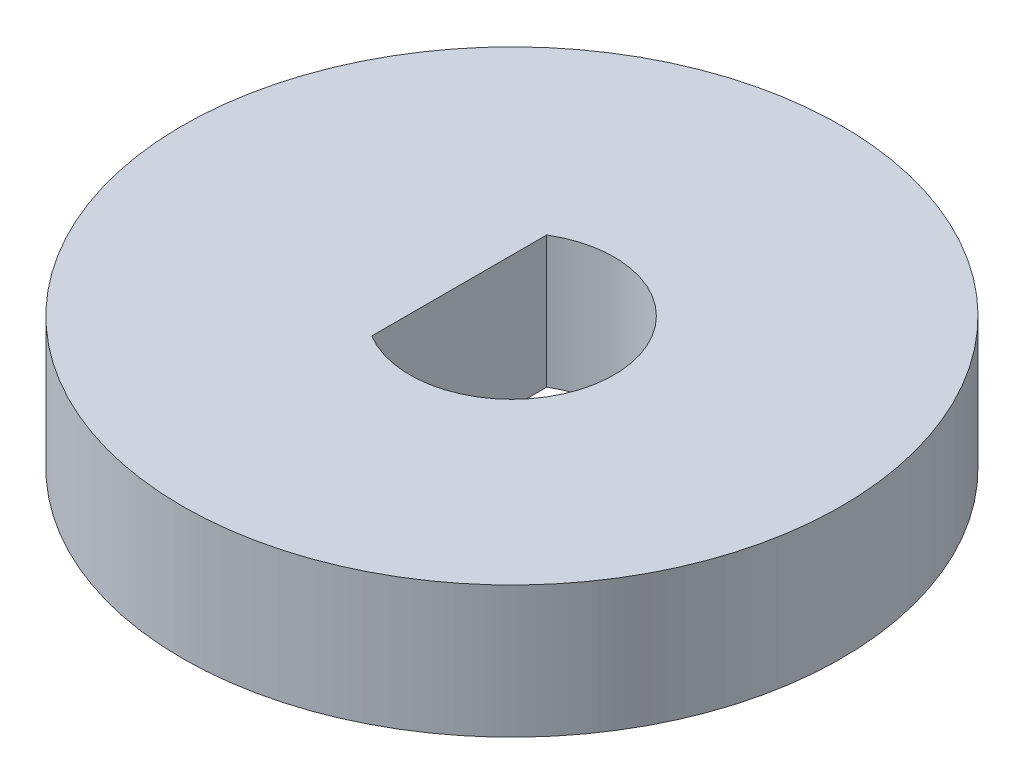
ISO-10303-21;
HEADER;
FILE_DESCRIPTION(('STEP AP214'),'2;1');
FILE_NAME('part.step','',(''),(''),'','','');
FILE_SCHEMA(('AUTOMOTIVE_DESIGN { 1 0 10303 214 1 1 1 1 }'));
ENDSEC;
DATA;
#1=APPLICATION_CONTEXT('core data for automotive mechanical design processes');
#2=APPLICATION_PROTOCOL_DEFINITION('international standard','automotive_design',2000,#1);
#3=PRODUCT_CONTEXT('',#1,'mechanical');
#4=PRODUCT('Part','Part','',(#3));
#5=PRODUCT_RELATED_PRODUCT_CATEGORY('part','',(#4));
#6=PRODUCT_DEFINITION_FORMATION('','',#4);
#7=PRODUCT_DEFINITION_CONTEXT('part definition',#1,'design');
#8=PRODUCT_DEFINITION('design','',#6,#7);
#9=PRODUCT_DEFINITION_SHAPE('','',#8);
#10=(LENGTH_UNIT() NAMED_UNIT(*) SI_UNIT(.MILLI.,.METRE.));
#11=(NAMED_UNIT(*) PLANE_ANGLE_UNIT() SI_UNIT($,.RADIAN.));
#12=(NAMED_UNIT(*) SI_UNIT($,.STERADIAN.) SOLID_ANGLE_UNIT());
#13=UNCERTAINTY_MEASURE_WITH_UNIT(LENGTH_MEASURE(1.E-05),#10,'distance_accuracy_value','');
#14=(GEOMETRIC_REPRESENTATION_CONTEXT(3) GLOBAL_UNCERTAINTY_ASSIGNED_CONTEXT((#13)) GLOBAL_UNIT_ASSIGNED_CONTEXT((#10,
#11,#12)) REPRESENTATION_CONTEXT('',''));
#15=CARTESIAN_POINT('',(0.,0.,0.));
#16=DIRECTION('',(0.,0.,1.));
#17=DIRECTION('',(1.,0.,0.));
#18=AXIS2_PLACEMENT_3D('',#15,#16,#17);
#19=CARTESIAN_POINT('',(0.,17.4,0.));
#20=DIRECTION('',(0.,1.,0.));
#21=DIRECTION('',(0.,0.,1.));
#22=AXIS2_PLACEMENT_3D('',#19,#20,#21);
#23=PLANE('',#22);
#24=CARTESIAN_POINT('',(0.,17.4,0.));
#25=DIRECTION('',(0.,1.,0.));
#26=DIRECTION('',(0.,0.,1.));
#27=AXIS2_PLACEMENT_3D('',#24,#25,#26);
#28=CIRCLE('',#27,9.99999999999999);
#29=CARTESIAN_POINT('',(0.,17.4,9.99999999999999));
#30=VERTEX_POINT('',#29);
#31=EDGE_CURVE('E11',#30,#30,#28,.T.);
#32=ORIENTED_EDGE('',*,*,#31,.F.);
#33=EDGE_LOOP('',(#32));
#34=FACE_BOUND('',#33,.T.);
#35=DIRECTION('',(0.,0.,-1.));
#36=VECTOR('',#35,1.);
#37=CARTESIAN_POINT('',(-1.6,17.4,0.));
#38=LINE('',#37,#36);
#39=CARTESIAN_POINT('',(-1.60000000000001,17.4,2.65518360947026));
#40=VERTEX_POINT('',#39);
#41=CARTESIAN_POINT('',(-1.60000000000001,17.4,-2.65518360947026));
#42=VERTEX_POINT('',#41);
#43=EDGE_CURVE('E66',#40,#42,#38,.T.);
#44=ORIENTED_EDGE('',*,*,#43,.F.);
#45=CARTESIAN_POINT('',(0.,17.4,0.));
#46=DIRECTION('',(0.,1.,0.));
#47=DIRECTION('',(0.,0.,1.));
#48=AXIS2_PLACEMENT_3D('',#45,#46,#47);
#49=CIRCLE('',#48,3.09999999999993);
#50=EDGE_CURVE('E77',#40,#42,#49,.T.);
#51=ORIENTED_EDGE('',*,*,#50,.T.);
#52=EDGE_LOOP('',(#44,#51));
#53=FACE_BOUND('',#52,.T.);
#54=ADVANCED_FACE('F35',(#34,#53),#23,.F.);
#55=CARTESIAN_POINT('',(0.,21.4,0.));
#56=DIRECTION('',(0.,1.,0.));
#57=DIRECTION('',(0.,0.,1.));
#58=AXIS2_PLACEMENT_3D('',#55,#56,#57);
#59=PLANE('',#58);
#60=CARTESIAN_POINT('',(0.,21.4,0.));
#61=DIRECTION('',(0.,1.,0.));
#62=DIRECTION('',(0.,0.,1.));
#63=AXIS2_PLACEMENT_3D('',#60,#61,#62);
#64=CIRCLE('',#63,9.99999999999999);
#65=CARTESIAN_POINT('',(0.,21.4,9.99999999999999));
#66=VERTEX_POINT('',#65);
#67=EDGE_CURVE('E39',#66,#66,#64,.T.);
#68=ORIENTED_EDGE('',*,*,#67,.T.);
#69=EDGE_LOOP('',(#68));
#70=FACE_BOUND('',#69,.T.);
#71=CARTESIAN_POINT('',(0.,21.4,0.));
#72=DIRECTION('',(0.,1.,0.));
#73=DIRECTION('',(0.,0.,1.));
#74=AXIS2_PLACEMENT_3D('',#71,#72,#73);
#75=CIRCLE('',#74,3.09999999999993);
#76=CARTESIAN_POINT('',(-1.60000000000001,21.4,2.65518360947026));
#77=VERTEX_POINT('',#76);
#78=CARTESIAN_POINT('',(-1.60000000000001,21.4,-2.65518360947026));
#79=VERTEX_POINT('',#78);
#80=EDGE_CURVE('E62',#77,#79,#75,.T.);
#81=ORIENTED_EDGE('',*,*,#80,.F.);
#82=DIRECTION('',(0.,0.,-1.));
#83=VECTOR('',#82,1.);
#84=CARTESIAN_POINT('',(-1.6,21.4,0.));
#85=LINE('',#84,#83);
#86=EDGE_CURVE('E67',#77,#79,#85,.T.);
#87=ORIENTED_EDGE('',*,*,#86,.T.);
#88=EDGE_LOOP('',(#81,#87));
#89=FACE_BOUND('',#88,.T.);
#90=ADVANCED_FACE('F74',(#70,#89),#59,.T.);
#91=CARTESIAN_POINT('',(0.,17.4,0.));
#92=DIRECTION('',(0.,1.,0.));
#93=DIRECTION('',(0.,0.,1.));
#94=AXIS2_PLACEMENT_3D('',#91,#92,#93);
#95=CYLINDRICAL_SURFACE('',#94,9.99999999999999);
#96=ORIENTED_EDGE('',*,*,#31,.T.);
#97=EDGE_LOOP('',(#96));
#98=FACE_BOUND('',#97,.T.);
#99=ORIENTED_EDGE('',*,*,#67,.F.);
#100=EDGE_LOOP('',(#99));
#101=FACE_BOUND('',#100,.T.);
#102=ADVANCED_FACE('F37',(#98,#101),#95,.T.);
#103=CARTESIAN_POINT('',(-1.6,17.4,0.));
#104=DIRECTION('',(1.,0.,0.));
#105=DIRECTION('',(0.,0.,-1.));
#106=AXIS2_PLACEMENT_3D('',#103,#104,#105);
#107=PLANE('',#106);
#108=ORIENTED_EDGE('',*,*,#86,.F.);
#109=DIRECTION('',(0.,1.,0.));
#110=VECTOR('',#109,1.);
#111=CARTESIAN_POINT('',(-1.60000000000001,17.4,2.65518360947026));
#112=LINE('',#111,#110);
#113=EDGE_CURVE('E56',#40,#77,#112,.T.);
#114=ORIENTED_EDGE('',*,*,#113,.F.);
#115=ORIENTED_EDGE('',*,*,#43,.T.);
#116=DIRECTION('',(0.,1.,0.));
#117=VECTOR('',#116,1.);
#118=CARTESIAN_POINT('',(-1.60000000000001,17.4,-2.65518360947026));
#119=LINE('',#118,#117);
#120=EDGE_CURVE('E51',#42,#79,#119,.T.);
#121=ORIENTED_EDGE('',*,*,#120,.T.);
#122=EDGE_LOOP('',(#108,#114,#115,#121));
#123=FACE_BOUND('',#122,.T.);
#124=ADVANCED_FACE('F70',(#123),#107,.T.);
#125=CARTESIAN_POINT('',(0.,17.4,0.));
#126=DIRECTION('',(0.,1.,0.));
#127=DIRECTION('',(0.,0.,1.));
#128=AXIS2_PLACEMENT_3D('',#125,#126,#127);
#129=CYLINDRICAL_SURFACE('',#128,3.09999999999993);
#130=ORIENTED_EDGE('',*,*,#80,.T.);
#131=ORIENTED_EDGE('',*,*,#120,.F.);
#132=ORIENTED_EDGE('',*,*,#50,.F.);
#133=ORIENTED_EDGE('',*,*,#113,.T.);
#134=EDGE_LOOP('',(#130,#131,#132,#133));
#135=FACE_BOUND('',#134,.T.);
#136=ADVANCED_FACE('F63',(#135),#129,.F.);
#137=CLOSED_SHELL('',(#54,#90,#102,#124,#136));
#138=MANIFOLD_SOLID_BREP('B2',#137);
#139=ADVANCED_BREP_SHAPE_REPRESENTATION('',(#18,#138),#14);
#140=SHAPE_DEFINITION_REPRESENTATION(#9,#139);
ENDSEC;
END-ISO-10303-21;
